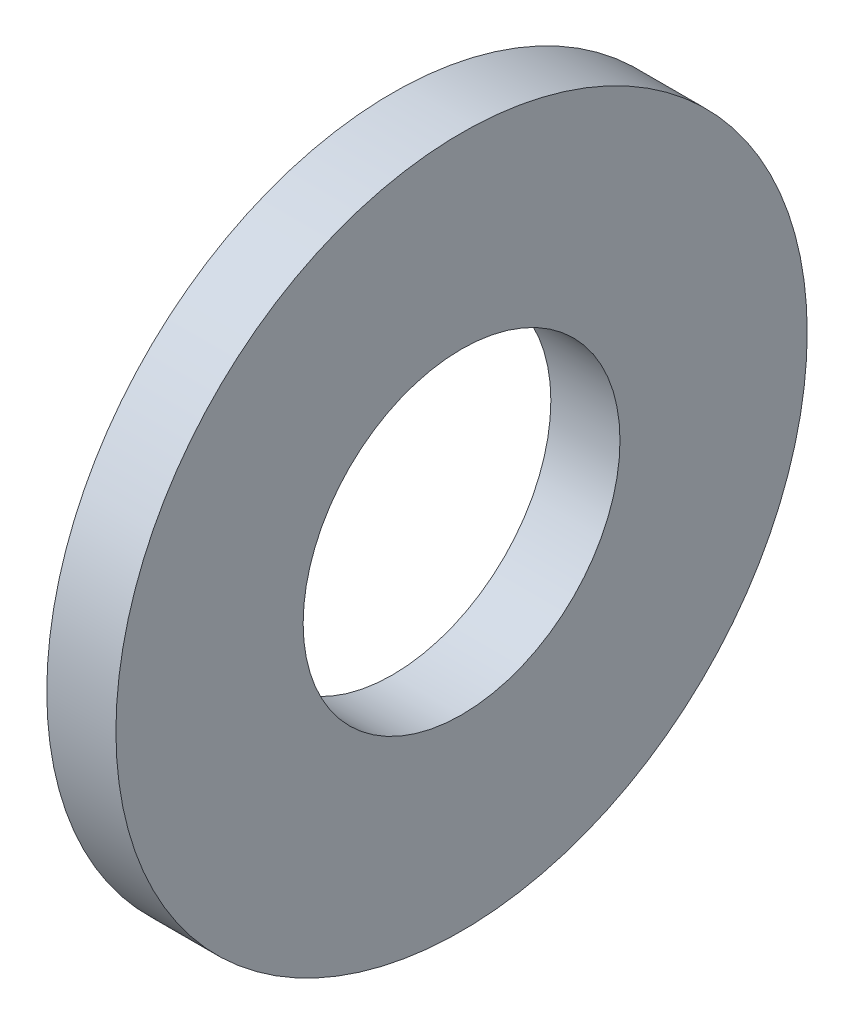
ISO-10303-21;
HEADER;
FILE_DESCRIPTION(('STEP AP214'),'2;1');
FILE_NAME('part.step','',(''),(''),'','','');
FILE_SCHEMA(('AUTOMOTIVE_DESIGN { 1 0 10303 214 1 1 1 1 }'));
ENDSEC;
DATA;
#1=APPLICATION_CONTEXT('core data for automotive mechanical design processes');
#2=APPLICATION_PROTOCOL_DEFINITION('international standard','automotive_design',2000,#1);
#3=PRODUCT_CONTEXT('',#1,'mechanical');
#4=PRODUCT('Part','Part','',(#3));
#5=PRODUCT_RELATED_PRODUCT_CATEGORY('part','',(#4));
#6=PRODUCT_DEFINITION_FORMATION('','',#4);
#7=PRODUCT_DEFINITION_CONTEXT('part definition',#1,'design');
#8=PRODUCT_DEFINITION('design','',#6,#7);
#9=PRODUCT_DEFINITION_SHAPE('','',#8);
#10=(LENGTH_UNIT() NAMED_UNIT(*) SI_UNIT(.MILLI.,.METRE.));
#11=(NAMED_UNIT(*) PLANE_ANGLE_UNIT() SI_UNIT($,.RADIAN.));
#12=(NAMED_UNIT(*) SI_UNIT($,.STERADIAN.) SOLID_ANGLE_UNIT());
#13=UNCERTAINTY_MEASURE_WITH_UNIT(LENGTH_MEASURE(1.E-05),#10,'distance_accuracy_value','');
#14=(GEOMETRIC_REPRESENTATION_CONTEXT(3) GLOBAL_UNCERTAINTY_ASSIGNED_CONTEXT((#13)) GLOBAL_UNIT_ASSIGNED_CONTEXT((#10,
#11,#12)) REPRESENTATION_CONTEXT('',''));
#15=CARTESIAN_POINT('',(0.,0.,0.));
#16=DIRECTION('',(0.,0.,1.));
#17=DIRECTION('',(1.,0.,0.));
#18=AXIS2_PLACEMENT_3D('',#15,#16,#17);
#19=CARTESIAN_POINT('',(0.6,0.,0.));
#20=DIRECTION('',(1.,0.,0.));
#21=DIRECTION('',(0.,0.,-1.));
#22=AXIS2_PLACEMENT_3D('',#19,#20,#21);
#23=PLANE('',#22);
#24=CARTESIAN_POINT('',(0.6,0.,0.));
#25=DIRECTION('',(1.,0.,0.));
#26=DIRECTION('',(0.,0.,-1.));
#27=AXIS2_PLACEMENT_3D('',#24,#25,#26);
#28=CIRCLE('',#27,3.);
#29=CARTESIAN_POINT('',(0.6,0.,-3.));
#30=VERTEX_POINT('',#29);
#31=EDGE_CURVE('E10',#30,#30,#28,.T.);
#32=ORIENTED_EDGE('',*,*,#31,.T.);
#33=EDGE_LOOP('',(#32));
#34=FACE_BOUND('',#33,.T.);
#35=CARTESIAN_POINT('',(0.6,0.,0.));
#36=DIRECTION('',(1.,0.,0.));
#37=DIRECTION('',(0.,0.,-1.));
#38=AXIS2_PLACEMENT_3D('',#35,#36,#37);
#39=CIRCLE('',#38,1.375);
#40=CARTESIAN_POINT('',(0.6,0.,-1.375));
#41=VERTEX_POINT('',#40);
#42=EDGE_CURVE('E39',#41,#41,#39,.T.);
#43=ORIENTED_EDGE('',*,*,#42,.F.);
#44=EDGE_LOOP('',(#43));
#45=FACE_BOUND('',#44,.T.);
#46=ADVANCED_FACE('F28',(#34,#45),#23,.T.);
#47=CARTESIAN_POINT('',(0.,0.,0.));
#48=DIRECTION('',(1.,0.,0.));
#49=DIRECTION('',(0.,0.,-1.));
#50=AXIS2_PLACEMENT_3D('',#47,#48,#49);
#51=PLANE('',#50);
#52=CARTESIAN_POINT('',(0.,0.,0.));
#53=DIRECTION('',(1.,0.,0.));
#54=DIRECTION('',(0.,0.,-1.));
#55=AXIS2_PLACEMENT_3D('',#52,#53,#54);
#56=CIRCLE('',#55,3.);
#57=CARTESIAN_POINT('',(0.,0.,-3.));
#58=VERTEX_POINT('',#57);
#59=EDGE_CURVE('E32',#58,#58,#56,.T.);
#60=ORIENTED_EDGE('',*,*,#59,.F.);
#61=EDGE_LOOP('',(#60));
#62=FACE_BOUND('',#61,.T.);
#63=CARTESIAN_POINT('',(0.,0.,0.));
#64=DIRECTION('',(1.,0.,0.));
#65=DIRECTION('',(0.,0.,-1.));
#66=AXIS2_PLACEMENT_3D('',#63,#64,#65);
#67=CIRCLE('',#66,1.375);
#68=CARTESIAN_POINT('',(0.,0.,-1.375));
#69=VERTEX_POINT('',#68);
#70=EDGE_CURVE('E41',#69,#69,#67,.T.);
#71=ORIENTED_EDGE('',*,*,#70,.T.);
#72=EDGE_LOOP('',(#71));
#73=FACE_BOUND('',#72,.T.);
#74=ADVANCED_FACE('F51',(#62,#73),#51,.F.);
#75=CARTESIAN_POINT('',(0.6,0.,0.));
#76=DIRECTION('',(-1.,0.,0.));
#77=DIRECTION('',(0.,0.,1.));
#78=AXIS2_PLACEMENT_3D('',#75,#76,#77);
#79=CYLINDRICAL_SURFACE('',#78,3.);
#80=ORIENTED_EDGE('',*,*,#31,.F.);
#81=EDGE_LOOP('',(#80));
#82=FACE_BOUND('',#81,.T.);
#83=ORIENTED_EDGE('',*,*,#59,.T.);
#84=EDGE_LOOP('',(#83));
#85=FACE_BOUND('',#84,.T.);
#86=ADVANCED_FACE('F30',(#82,#85),#79,.T.);
#87=CARTESIAN_POINT('',(0.6,0.,0.));
#88=DIRECTION('',(-1.,0.,0.));
#89=DIRECTION('',(0.,0.,1.));
#90=AXIS2_PLACEMENT_3D('',#87,#88,#89);
#91=CYLINDRICAL_SURFACE('',#90,1.375);
#92=ORIENTED_EDGE('',*,*,#42,.T.);
#93=EDGE_LOOP('',(#92));
#94=FACE_BOUND('',#93,.T.);
#95=ORIENTED_EDGE('',*,*,#70,.F.);
#96=EDGE_LOOP('',(#95));
#97=FACE_BOUND('',#96,.T.);
#98=ADVANCED_FACE('F47',(#94,#97),#91,.F.);
#99=CLOSED_SHELL('',(#46,#74,#86,#98));
#100=MANIFOLD_SOLID_BREP('B2',#99);
#101=ADVANCED_BREP_SHAPE_REPRESENTATION('',(#18,#100),#14);
#102=SHAPE_DEFINITION_REPRESENTATION(#9,#101);
ENDSEC;
END-ISO-10303-21;
